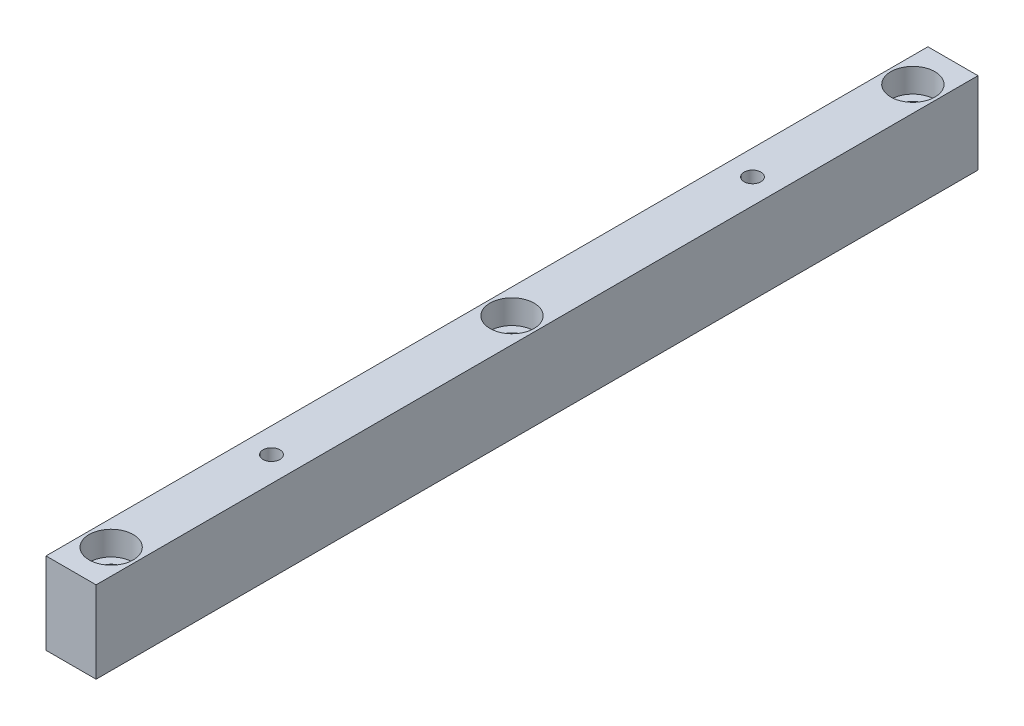
ISO-10303-21;
HEADER;
FILE_DESCRIPTION(('STEP AP214'),'2;1');
FILE_NAME('part.step','',(''),(''),'','','');
FILE_SCHEMA(('AUTOMOTIVE_DESIGN { 1 0 10303 214 1 1 1 1 }'));
ENDSEC;
DATA;
#1=APPLICATION_CONTEXT('core data for automotive mechanical design processes');
#2=APPLICATION_PROTOCOL_DEFINITION('international standard','automotive_design',2000,#1);
#3=PRODUCT_CONTEXT('',#1,'mechanical');
#4=PRODUCT('Part','Part','',(#3));
#5=PRODUCT_RELATED_PRODUCT_CATEGORY('part','',(#4));
#6=PRODUCT_DEFINITION_FORMATION('','',#4);
#7=PRODUCT_DEFINITION_CONTEXT('part definition',#1,'design');
#8=PRODUCT_DEFINITION('design','',#6,#7);
#9=PRODUCT_DEFINITION_SHAPE('','',#8);
#10=(LENGTH_UNIT() NAMED_UNIT(*) SI_UNIT(.MILLI.,.METRE.));
#11=(NAMED_UNIT(*) PLANE_ANGLE_UNIT() SI_UNIT($,.RADIAN.));
#12=(NAMED_UNIT(*) SI_UNIT($,.STERADIAN.) SOLID_ANGLE_UNIT());
#13=UNCERTAINTY_MEASURE_WITH_UNIT(LENGTH_MEASURE(1.E-05),#10,'distance_accuracy_value','');
#14=(GEOMETRIC_REPRESENTATION_CONTEXT(3) GLOBAL_UNCERTAINTY_ASSIGNED_CONTEXT((#13)) GLOBAL_UNIT_ASSIGNED_CONTEXT((#10,
#11,#12)) REPRESENTATION_CONTEXT('',''));
#15=CARTESIAN_POINT('',(0.,0.,0.));
#16=DIRECTION('',(0.,0.,1.));
#17=DIRECTION('',(1.,0.,0.));
#18=AXIS2_PLACEMENT_3D('',#15,#16,#17);
#19=CARTESIAN_POINT('',(0.,20.4,0.));
#20=DIRECTION('',(1.,0.,0.));
#21=DIRECTION('',(0.,0.,-1.));
#22=AXIS2_PLACEMENT_3D('',#19,#20,#21);
#23=PLANE('',#22);
#24=DIRECTION('',(0.,0.,1.));
#25=VECTOR('',#24,1.);
#26=CARTESIAN_POINT('',(0.,0.,0.));
#27=LINE('',#26,#25);
#28=CARTESIAN_POINT('',(0.,0.,-220.));
#29=VERTEX_POINT('',#28);
#30=CARTESIAN_POINT('',(0.,0.,0.));
#31=VERTEX_POINT('',#30);
#32=EDGE_CURVE('E104',#29,#31,#27,.T.);
#33=ORIENTED_EDGE('',*,*,#32,.T.);
#34=DIRECTION('',(0.,-1.,0.));
#35=VECTOR('',#34,1.);
#36=CARTESIAN_POINT('',(0.,20.4,0.));
#37=LINE('',#36,#35);
#38=CARTESIAN_POINT('',(0.,20.4,0.));
#39=VERTEX_POINT('',#38);
#40=EDGE_CURVE('E11',#39,#31,#37,.T.);
#41=ORIENTED_EDGE('',*,*,#40,.F.);
#42=DIRECTION('',(0.,0.,1.));
#43=VECTOR('',#42,1.);
#44=CARTESIAN_POINT('',(0.,20.4,0.));
#45=LINE('',#44,#43);
#46=CARTESIAN_POINT('',(0.,20.4,-220.));
#47=VERTEX_POINT('',#46);
#48=EDGE_CURVE('E92',#47,#39,#45,.T.);
#49=ORIENTED_EDGE('',*,*,#48,.F.);
#50=DIRECTION('',(0.,-1.,0.));
#51=VECTOR('',#50,1.);
#52=CARTESIAN_POINT('',(0.,20.4,-220.));
#53=LINE('',#52,#51);
#54=EDGE_CURVE('E100',#47,#29,#53,.T.);
#55=ORIENTED_EDGE('',*,*,#54,.T.);
#56=EDGE_LOOP('',(#33,#41,#49,#55));
#57=FACE_BOUND('',#56,.T.);
#58=ADVANCED_FACE('F41',(#57),#23,.F.);
#59=CARTESIAN_POINT('',(0.,20.4,0.));
#60=DIRECTION('',(0.,0.,-1.));
#61=DIRECTION('',(-1.,0.,0.));
#62=AXIS2_PLACEMENT_3D('',#59,#60,#61);
#63=PLANE('',#62);
#64=DIRECTION('',(1.,0.,0.));
#65=VECTOR('',#64,1.);
#66=CARTESIAN_POINT('',(0.,0.,0.));
#67=LINE('',#66,#65);
#68=CARTESIAN_POINT('',(12.5,0.,0.));
#69=VERTEX_POINT('',#68);
#70=EDGE_CURVE('E96',#31,#69,#67,.T.);
#71=ORIENTED_EDGE('',*,*,#70,.T.);
#72=DIRECTION('',(0.,-1.,0.));
#73=VECTOR('',#72,1.);
#74=CARTESIAN_POINT('',(12.5,20.4,0.));
#75=LINE('',#74,#73);
#76=CARTESIAN_POINT('',(12.5,20.4,0.));
#77=VERTEX_POINT('',#76);
#78=EDGE_CURVE('E49',#77,#69,#75,.T.);
#79=ORIENTED_EDGE('',*,*,#78,.F.);
#80=DIRECTION('',(1.,0.,0.));
#81=VECTOR('',#80,1.);
#82=CARTESIAN_POINT('',(0.,20.4,0.));
#83=LINE('',#82,#81);
#84=EDGE_CURVE('E87',#39,#77,#83,.T.);
#85=ORIENTED_EDGE('',*,*,#84,.F.);
#86=ORIENTED_EDGE('',*,*,#40,.T.);
#87=EDGE_LOOP('',(#71,#79,#85,#86));
#88=FACE_BOUND('',#87,.T.);
#89=ADVANCED_FACE('F95',(#88),#63,.F.);
#90=CARTESIAN_POINT('',(12.5,20.4,0.));
#91=DIRECTION('',(-1.,0.,0.));
#92=DIRECTION('',(0.,0.,1.));
#93=AXIS2_PLACEMENT_3D('',#90,#91,#92);
#94=PLANE('',#93);
#95=DIRECTION('',(0.,0.,-1.));
#96=VECTOR('',#95,1.);
#97=CARTESIAN_POINT('',(12.5,0.,0.));
#98=LINE('',#97,#96);
#99=CARTESIAN_POINT('',(12.5,0.,-220.));
#100=VERTEX_POINT('',#99);
#101=EDGE_CURVE('E74',#69,#100,#98,.T.);
#102=ORIENTED_EDGE('',*,*,#101,.T.);
#103=DIRECTION('',(0.,-1.,0.));
#104=VECTOR('',#103,1.);
#105=CARTESIAN_POINT('',(12.5,20.4,-220.));
#106=LINE('',#105,#104);
#107=CARTESIAN_POINT('',(12.5,20.4,-220.));
#108=VERTEX_POINT('',#107);
#109=EDGE_CURVE('E97',#108,#100,#106,.T.);
#110=ORIENTED_EDGE('',*,*,#109,.F.);
#111=DIRECTION('',(0.,0.,-1.));
#112=VECTOR('',#111,1.);
#113=CARTESIAN_POINT('',(12.5,20.4,0.));
#114=LINE('',#113,#112);
#115=EDGE_CURVE('E90',#77,#108,#114,.T.);
#116=ORIENTED_EDGE('',*,*,#115,.F.);
#117=ORIENTED_EDGE('',*,*,#78,.T.);
#118=EDGE_LOOP('',(#102,#110,#116,#117));
#119=FACE_BOUND('',#118,.T.);
#120=ADVANCED_FACE('F98',(#119),#94,.F.);
#121=CARTESIAN_POINT('',(0.,20.4,-220.));
#122=DIRECTION('',(0.,0.,1.));
#123=DIRECTION('',(1.,0.,0.));
#124=AXIS2_PLACEMENT_3D('',#121,#122,#123);
#125=PLANE('',#124);
#126=DIRECTION('',(-1.,0.,0.));
#127=VECTOR('',#126,1.);
#128=CARTESIAN_POINT('',(0.,0.,-220.));
#129=LINE('',#128,#127);
#130=EDGE_CURVE('E80',#100,#29,#129,.T.);
#131=ORIENTED_EDGE('',*,*,#130,.T.);
#132=ORIENTED_EDGE('',*,*,#54,.F.);
#133=DIRECTION('',(-1.,0.,0.));
#134=VECTOR('',#133,1.);
#135=CARTESIAN_POINT('',(0.,20.4,-220.));
#136=LINE('',#135,#134);
#137=EDGE_CURVE('E57',#108,#47,#136,.T.);
#138=ORIENTED_EDGE('',*,*,#137,.F.);
#139=ORIENTED_EDGE('',*,*,#109,.T.);
#140=EDGE_LOOP('',(#131,#132,#138,#139));
#141=FACE_BOUND('',#140,.T.);
#142=ADVANCED_FACE('F112',(#141),#125,.F.);
#143=CARTESIAN_POINT('',(0.,20.4,0.));
#144=DIRECTION('',(0.,-1.,0.));
#145=DIRECTION('',(0.,0.,-1.));
#146=AXIS2_PLACEMENT_3D('',#143,#144,#145);
#147=PLANE('',#146);
#148=CARTESIAN_POINT('',(6.25,20.4,-50.));
#149=DIRECTION('',(0.,1.,0.));
#150=DIRECTION('',(0.,0.,1.));
#151=AXIS2_PLACEMENT_3D('',#148,#149,#150);
#152=CIRCLE('',#151,2.1);
#153=CARTESIAN_POINT('',(6.25,20.4,-47.9));
#154=VERTEX_POINT('',#153);
#155=EDGE_CURVE('E162',#154,#154,#152,.T.);
#156=ORIENTED_EDGE('',*,*,#155,.F.);
#157=EDGE_LOOP('',(#156));
#158=FACE_BOUND('',#157,.T.);
#159=CARTESIAN_POINT('',(6.25,20.4,-170.));
#160=DIRECTION('',(0.,1.,0.));
#161=DIRECTION('',(0.,0.,1.));
#162=AXIS2_PLACEMENT_3D('',#159,#160,#161);
#163=CIRCLE('',#162,2.1);
#164=CARTESIAN_POINT('',(6.25,20.4,-167.9));
#165=VERTEX_POINT('',#164);
#166=EDGE_CURVE('E156',#165,#165,#163,.T.);
#167=ORIENTED_EDGE('',*,*,#166,.F.);
#168=EDGE_LOOP('',(#167));
#169=FACE_BOUND('',#168,.T.);
#170=CARTESIAN_POINT('',(6.25,20.4,-9.99999999999999));
#171=DIRECTION('',(0.,1.,0.));
#172=DIRECTION('',(0.,0.,1.));
#173=AXIS2_PLACEMENT_3D('',#170,#171,#172);
#174=CIRCLE('',#173,5.5);
#175=CARTESIAN_POINT('',(6.25,20.4,-4.5));
#176=VERTEX_POINT('',#175);
#177=EDGE_CURVE('E150',#176,#176,#174,.T.);
#178=ORIENTED_EDGE('',*,*,#177,.F.);
#179=EDGE_LOOP('',(#178));
#180=FACE_BOUND('',#179,.T.);
#181=CARTESIAN_POINT('',(6.25,20.4,-110.));
#182=DIRECTION('',(0.,1.,0.));
#183=DIRECTION('',(0.,0.,1.));
#184=AXIS2_PLACEMENT_3D('',#181,#182,#183);
#185=CIRCLE('',#184,5.5);
#186=CARTESIAN_POINT('',(6.25,20.4,-104.5));
#187=VERTEX_POINT('',#186);
#188=EDGE_CURVE('E138',#187,#187,#185,.T.);
#189=ORIENTED_EDGE('',*,*,#188,.F.);
#190=EDGE_LOOP('',(#189));
#191=FACE_BOUND('',#190,.T.);
#192=CARTESIAN_POINT('',(6.25,20.4,-210.));
#193=DIRECTION('',(0.,1.,0.));
#194=DIRECTION('',(0.,0.,1.));
#195=AXIS2_PLACEMENT_3D('',#192,#193,#194);
#196=CIRCLE('',#195,5.5);
#197=CARTESIAN_POINT('',(6.25,20.4,-204.5));
#198=VERTEX_POINT('',#197);
#199=EDGE_CURVE('E126',#198,#198,#196,.T.);
#200=ORIENTED_EDGE('',*,*,#199,.F.);
#201=EDGE_LOOP('',(#200));
#202=FACE_BOUND('',#201,.T.);
#203=ORIENTED_EDGE('',*,*,#48,.T.);
#204=ORIENTED_EDGE('',*,*,#84,.T.);
#205=ORIENTED_EDGE('',*,*,#115,.T.);
#206=ORIENTED_EDGE('',*,*,#137,.T.);
#207=EDGE_LOOP('',(#203,#204,#205,#206));
#208=FACE_BOUND('',#207,.T.);
#209=ADVANCED_FACE('F88',(#158,#169,#180,#191,#202,#208),#147,.F.);
#210=CARTESIAN_POINT('',(0.,0.,0.));
#211=DIRECTION('',(0.,-1.,0.));
#212=DIRECTION('',(0.,0.,-1.));
#213=AXIS2_PLACEMENT_3D('',#210,#211,#212);
#214=PLANE('',#213);
#215=CARTESIAN_POINT('',(6.25,0.,-50.));
#216=DIRECTION('',(0.,1.,0.));
#217=DIRECTION('',(0.,0.,1.));
#218=AXIS2_PLACEMENT_3D('',#215,#216,#217);
#219=CIRCLE('',#218,2.1);
#220=CARTESIAN_POINT('',(6.25,0.,-47.9));
#221=VERTEX_POINT('',#220);
#222=EDGE_CURVE('E159',#221,#221,#219,.T.);
#223=ORIENTED_EDGE('',*,*,#222,.T.);
#224=EDGE_LOOP('',(#223));
#225=FACE_BOUND('',#224,.T.);
#226=CARTESIAN_POINT('',(6.25,0.,-170.));
#227=DIRECTION('',(0.,1.,0.));
#228=DIRECTION('',(0.,0.,1.));
#229=AXIS2_PLACEMENT_3D('',#226,#227,#228);
#230=CIRCLE('',#229,2.1);
#231=CARTESIAN_POINT('',(6.25,0.,-167.9));
#232=VERTEX_POINT('',#231);
#233=EDGE_CURVE('E153',#232,#232,#230,.T.);
#234=ORIENTED_EDGE('',*,*,#233,.T.);
#235=EDGE_LOOP('',(#234));
#236=FACE_BOUND('',#235,.T.);
#237=CARTESIAN_POINT('',(6.25,0.,-9.99999999999999));
#238=DIRECTION('',(0.,1.,0.));
#239=DIRECTION('',(0.,0.,1.));
#240=AXIS2_PLACEMENT_3D('',#237,#238,#239);
#241=CIRCLE('',#240,3.3);
#242=CARTESIAN_POINT('',(6.25,0.,-6.7));
#243=VERTEX_POINT('',#242);
#244=EDGE_CURVE('E141',#243,#243,#241,.T.);
#245=ORIENTED_EDGE('',*,*,#244,.T.);
#246=EDGE_LOOP('',(#245));
#247=FACE_BOUND('',#246,.T.);
#248=CARTESIAN_POINT('',(6.25,0.,-110.));
#249=DIRECTION('',(0.,1.,0.));
#250=DIRECTION('',(0.,0.,1.));
#251=AXIS2_PLACEMENT_3D('',#248,#249,#250);
#252=CIRCLE('',#251,3.3);
#253=CARTESIAN_POINT('',(6.25,0.,-106.7));
#254=VERTEX_POINT('',#253);
#255=EDGE_CURVE('E129',#254,#254,#252,.T.);
#256=ORIENTED_EDGE('',*,*,#255,.T.);
#257=EDGE_LOOP('',(#256));
#258=FACE_BOUND('',#257,.T.);
#259=CARTESIAN_POINT('',(6.25,0.,-210.));
#260=DIRECTION('',(0.,1.,0.));
#261=DIRECTION('',(0.,0.,1.));
#262=AXIS2_PLACEMENT_3D('',#259,#260,#261);
#263=CIRCLE('',#262,3.3);
#264=CARTESIAN_POINT('',(6.25,0.,-206.7));
#265=VERTEX_POINT('',#264);
#266=EDGE_CURVE('E107',#265,#265,#263,.T.);
#267=ORIENTED_EDGE('',*,*,#266,.T.);
#268=EDGE_LOOP('',(#267));
#269=FACE_BOUND('',#268,.T.);
#270=ORIENTED_EDGE('',*,*,#32,.F.);
#271=ORIENTED_EDGE('',*,*,#130,.F.);
#272=ORIENTED_EDGE('',*,*,#101,.F.);
#273=ORIENTED_EDGE('',*,*,#70,.F.);
#274=EDGE_LOOP('',(#270,#271,#272,#273));
#275=FACE_BOUND('',#274,.T.);
#276=ADVANCED_FACE('F115',(#225,#236,#247,#258,#269,#275),#214,.T.);
#277=CARTESIAN_POINT('',(6.25,20.4,-210.));
#278=DIRECTION('',(0.,1.,0.));
#279=DIRECTION('',(0.,0.,1.));
#280=AXIS2_PLACEMENT_3D('',#277,#278,#279);
#281=CYLINDRICAL_SURFACE('',#280,3.3);
#282=ORIENTED_EDGE('',*,*,#266,.F.);
#283=EDGE_LOOP('',(#282));
#284=FACE_BOUND('',#283,.T.);
#285=CARTESIAN_POINT('',(6.25,14.4,-210.));
#286=DIRECTION('',(0.,1.,0.));
#287=DIRECTION('',(0.,0.,1.));
#288=AXIS2_PLACEMENT_3D('',#285,#286,#287);
#289=CIRCLE('',#288,3.3);
#290=CARTESIAN_POINT('',(6.25,14.4,-206.7));
#291=VERTEX_POINT('',#290);
#292=EDGE_CURVE('E120',#291,#291,#289,.T.);
#293=ORIENTED_EDGE('',*,*,#292,.T.);
#294=EDGE_LOOP('',(#293));
#295=FACE_BOUND('',#294,.T.);
#296=ADVANCED_FACE('F192',(#284,#295),#281,.F.);
#297=CARTESIAN_POINT('',(9.55,14.4,-210.));
#298=DIRECTION('',(0.,-1.,0.));
#299=DIRECTION('',(0.,0.,-1.));
#300=AXIS2_PLACEMENT_3D('',#297,#298,#299);
#301=PLANE('',#300);
#302=ORIENTED_EDGE('',*,*,#292,.F.);
#303=EDGE_LOOP('',(#302));
#304=FACE_BOUND('',#303,.T.);
#305=CARTESIAN_POINT('',(6.25,14.4,-210.));
#306=DIRECTION('',(0.,1.,0.));
#307=DIRECTION('',(0.,0.,1.));
#308=AXIS2_PLACEMENT_3D('',#305,#306,#307);
#309=CIRCLE('',#308,5.5);
#310=CARTESIAN_POINT('',(6.25,14.4,-204.5));
#311=VERTEX_POINT('',#310);
#312=EDGE_CURVE('E123',#311,#311,#309,.T.);
#313=ORIENTED_EDGE('',*,*,#312,.T.);
#314=EDGE_LOOP('',(#313));
#315=FACE_BOUND('',#314,.T.);
#316=ADVANCED_FACE('F182',(#304,#315),#301,.F.);
#317=CARTESIAN_POINT('',(6.25,20.4,-210.));
#318=DIRECTION('',(0.,1.,0.));
#319=DIRECTION('',(0.,0.,1.));
#320=AXIS2_PLACEMENT_3D('',#317,#318,#319);
#321=CYLINDRICAL_SURFACE('',#320,5.5);
#322=ORIENTED_EDGE('',*,*,#312,.F.);
#323=EDGE_LOOP('',(#322));
#324=FACE_BOUND('',#323,.T.);
#325=ORIENTED_EDGE('',*,*,#199,.T.);
#326=EDGE_LOOP('',(#325));
#327=FACE_BOUND('',#326,.T.);
#328=ADVANCED_FACE('F179',(#324,#327),#321,.F.);
#329=CARTESIAN_POINT('',(6.25,20.4,-110.));
#330=DIRECTION('',(0.,1.,0.));
#331=DIRECTION('',(0.,0.,1.));
#332=AXIS2_PLACEMENT_3D('',#329,#330,#331);
#333=CYLINDRICAL_SURFACE('',#332,3.3);
#334=ORIENTED_EDGE('',*,*,#255,.F.);
#335=EDGE_LOOP('',(#334));
#336=FACE_BOUND('',#335,.T.);
#337=CARTESIAN_POINT('',(6.25,14.4,-110.));
#338=DIRECTION('',(0.,1.,0.));
#339=DIRECTION('',(0.,0.,1.));
#340=AXIS2_PLACEMENT_3D('',#337,#338,#339);
#341=CIRCLE('',#340,3.3);
#342=CARTESIAN_POINT('',(6.25,14.4,-106.7));
#343=VERTEX_POINT('',#342);
#344=EDGE_CURVE('E132',#343,#343,#341,.T.);
#345=ORIENTED_EDGE('',*,*,#344,.T.);
#346=EDGE_LOOP('',(#345));
#347=FACE_BOUND('',#346,.T.);
#348=ADVANCED_FACE('F181',(#336,#347),#333,.F.);
#349=CARTESIAN_POINT('',(9.55,14.4,-110.));
#350=DIRECTION('',(0.,-1.,0.));
#351=DIRECTION('',(0.,0.,-1.));
#352=AXIS2_PLACEMENT_3D('',#349,#350,#351);
#353=PLANE('',#352);
#354=ORIENTED_EDGE('',*,*,#344,.F.);
#355=EDGE_LOOP('',(#354));
#356=FACE_BOUND('',#355,.T.);
#357=CARTESIAN_POINT('',(6.25,14.4,-110.));
#358=DIRECTION('',(0.,1.,0.));
#359=DIRECTION('',(0.,0.,1.));
#360=AXIS2_PLACEMENT_3D('',#357,#358,#359);
#361=CIRCLE('',#360,5.5);
#362=CARTESIAN_POINT('',(6.25,14.4,-104.5));
#363=VERTEX_POINT('',#362);
#364=EDGE_CURVE('E135',#363,#363,#361,.T.);
#365=ORIENTED_EDGE('',*,*,#364,.T.);
#366=EDGE_LOOP('',(#365));
#367=FACE_BOUND('',#366,.T.);
#368=ADVANCED_FACE('F189',(#356,#367),#353,.F.);
#369=CARTESIAN_POINT('',(6.25,20.4,-110.));
#370=DIRECTION('',(0.,1.,0.));
#371=DIRECTION('',(0.,0.,1.));
#372=AXIS2_PLACEMENT_3D('',#369,#370,#371);
#373=CYLINDRICAL_SURFACE('',#372,5.5);
#374=ORIENTED_EDGE('',*,*,#364,.F.);
#375=EDGE_LOOP('',(#374));
#376=FACE_BOUND('',#375,.T.);
#377=ORIENTED_EDGE('',*,*,#188,.T.);
#378=EDGE_LOOP('',(#377));
#379=FACE_BOUND('',#378,.T.);
#380=ADVANCED_FACE('F245',(#376,#379),#373,.F.);
#381=CARTESIAN_POINT('',(6.25,20.4,-9.99999999999999));
#382=DIRECTION('',(0.,1.,0.));
#383=DIRECTION('',(0.,0.,1.));
#384=AXIS2_PLACEMENT_3D('',#381,#382,#383);
#385=CYLINDRICAL_SURFACE('',#384,3.3);
#386=ORIENTED_EDGE('',*,*,#244,.F.);
#387=EDGE_LOOP('',(#386));
#388=FACE_BOUND('',#387,.T.);
#389=CARTESIAN_POINT('',(6.25,14.4,-9.99999999999999));
#390=DIRECTION('',(0.,1.,0.));
#391=DIRECTION('',(0.,0.,1.));
#392=AXIS2_PLACEMENT_3D('',#389,#390,#391);
#393=CIRCLE('',#392,3.3);
#394=CARTESIAN_POINT('',(6.25,14.4,-6.69999999999999));
#395=VERTEX_POINT('',#394);
#396=EDGE_CURVE('E144',#395,#395,#393,.T.);
#397=ORIENTED_EDGE('',*,*,#396,.T.);
#398=EDGE_LOOP('',(#397));
#399=FACE_BOUND('',#398,.T.);
#400=ADVANCED_FACE('F255',(#388,#399),#385,.F.);
#401=CARTESIAN_POINT('',(9.55,14.4,-9.99999999999999));
#402=DIRECTION('',(0.,-1.,0.));
#403=DIRECTION('',(0.,0.,-1.));
#404=AXIS2_PLACEMENT_3D('',#401,#402,#403);
#405=PLANE('',#404);
#406=ORIENTED_EDGE('',*,*,#396,.F.);
#407=EDGE_LOOP('',(#406));
#408=FACE_BOUND('',#407,.T.);
#409=CARTESIAN_POINT('',(6.25,14.4,-9.99999999999999));
#410=DIRECTION('',(0.,1.,0.));
#411=DIRECTION('',(0.,0.,1.));
#412=AXIS2_PLACEMENT_3D('',#409,#410,#411);
#413=CIRCLE('',#412,5.5);
#414=CARTESIAN_POINT('',(6.25,14.4,-4.5));
#415=VERTEX_POINT('',#414);
#416=EDGE_CURVE('E147',#415,#415,#413,.T.);
#417=ORIENTED_EDGE('',*,*,#416,.T.);
#418=EDGE_LOOP('',(#417));
#419=FACE_BOUND('',#418,.T.);
#420=ADVANCED_FACE('F265',(#408,#419),#405,.F.);
#421=CARTESIAN_POINT('',(6.25,20.4,-9.99999999999999));
#422=DIRECTION('',(0.,1.,0.));
#423=DIRECTION('',(0.,0.,1.));
#424=AXIS2_PLACEMENT_3D('',#421,#422,#423);
#425=CYLINDRICAL_SURFACE('',#424,5.5);
#426=ORIENTED_EDGE('',*,*,#416,.F.);
#427=EDGE_LOOP('',(#426));
#428=FACE_BOUND('',#427,.T.);
#429=ORIENTED_EDGE('',*,*,#177,.T.);
#430=EDGE_LOOP('',(#429));
#431=FACE_BOUND('',#430,.T.);
#432=ADVANCED_FACE('F275',(#428,#431),#425,.F.);
#433=CARTESIAN_POINT('',(6.25,20.4,-170.));
#434=DIRECTION('',(0.,1.,0.));
#435=DIRECTION('',(0.,0.,1.));
#436=AXIS2_PLACEMENT_3D('',#433,#434,#435);
#437=CYLINDRICAL_SURFACE('',#436,2.1);
#438=ORIENTED_EDGE('',*,*,#233,.F.);
#439=EDGE_LOOP('',(#438));
#440=FACE_BOUND('',#439,.T.);
#441=ORIENTED_EDGE('',*,*,#166,.T.);
#442=EDGE_LOOP('',(#441));
#443=FACE_BOUND('',#442,.T.);
#444=ADVANCED_FACE('F285',(#440,#443),#437,.F.);
#445=CARTESIAN_POINT('',(6.25,20.4,-50.));
#446=DIRECTION('',(0.,1.,0.));
#447=DIRECTION('',(0.,0.,1.));
#448=AXIS2_PLACEMENT_3D('',#445,#446,#447);
#449=CYLINDRICAL_SURFACE('',#448,2.1);
#450=ORIENTED_EDGE('',*,*,#222,.F.);
#451=EDGE_LOOP('',(#450));
#452=FACE_BOUND('',#451,.T.);
#453=ORIENTED_EDGE('',*,*,#155,.T.);
#454=EDGE_LOOP('',(#453));
#455=FACE_BOUND('',#454,.T.);
#456=ADVANCED_FACE('F166',(#452,#455),#449,.F.);
#457=CLOSED_SHELL('',(#58,#89,#120,#142,#209,#276,#296,#316,#328,#348,#368,#380,#400,#420,#432,
#444,#456));
#458=MANIFOLD_SOLID_BREP('B2',#457);
#459=ADVANCED_BREP_SHAPE_REPRESENTATION('',(#18,#458),#14);
#460=SHAPE_DEFINITION_REPRESENTATION(#9,#459);
ENDSEC;
END-ISO-10303-21;
